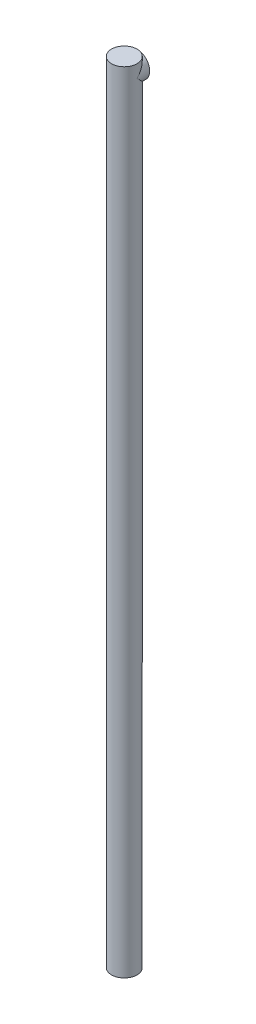
ISO-10303-21;
HEADER;
FILE_DESCRIPTION(('STEP AP214'),'2;1');
FILE_NAME('part.step','',(''),(''),'','','');
FILE_SCHEMA(('AUTOMOTIVE_DESIGN { 1 0 10303 214 1 1 1 1 }'));
ENDSEC;
DATA;
#1=APPLICATION_CONTEXT('core data for automotive mechanical design processes');
#2=APPLICATION_PROTOCOL_DEFINITION('international standard','automotive_design',2000,#1);
#3=PRODUCT_CONTEXT('',#1,'mechanical');
#4=PRODUCT('Part','Part','',(#3));
#5=PRODUCT_RELATED_PRODUCT_CATEGORY('part','',(#4));
#6=PRODUCT_DEFINITION_FORMATION('','',#4);
#7=PRODUCT_DEFINITION_CONTEXT('part definition',#1,'design');
#8=PRODUCT_DEFINITION('design','',#6,#7);
#9=PRODUCT_DEFINITION_SHAPE('','',#8);
#10=(LENGTH_UNIT() NAMED_UNIT(*) SI_UNIT(.MILLI.,.METRE.));
#11=(NAMED_UNIT(*) PLANE_ANGLE_UNIT() SI_UNIT($,.RADIAN.));
#12=(NAMED_UNIT(*) SI_UNIT($,.STERADIAN.) SOLID_ANGLE_UNIT());
#13=UNCERTAINTY_MEASURE_WITH_UNIT(LENGTH_MEASURE(1.E-05),#10,'distance_accuracy_value','');
#14=(GEOMETRIC_REPRESENTATION_CONTEXT(3) GLOBAL_UNCERTAINTY_ASSIGNED_CONTEXT((#13)) GLOBAL_UNIT_ASSIGNED_CONTEXT((#10,
#11,#12)) REPRESENTATION_CONTEXT('',''));
#15=CARTESIAN_POINT('',(0.,0.,0.));
#16=DIRECTION('',(0.,0.,1.));
#17=DIRECTION('',(1.,0.,0.));
#18=AXIS2_PLACEMENT_3D('',#15,#16,#17);
#19=CARTESIAN_POINT('',(0.,155.,0.));
#20=DIRECTION('',(0.,-1.,0.));
#21=DIRECTION('',(0.,0.,-1.));
#22=AXIS2_PLACEMENT_3D('',#19,#20,#21);
#23=CYLINDRICAL_SURFACE('',#22,2.5);
#24=CARTESIAN_POINT('',(0.,152.5,0.));
#25=DIRECTION('',(0.,-0.707106781186547,0.707106781186547));
#26=DIRECTION('',(0.,-0.707106781186547,-0.707106781186547));
#27=AXIS2_PLACEMENT_3D('',#24,#25,#26);
#28=ELLIPSE('',#27,3.53553390593274,2.5);
#29=CARTESIAN_POINT('',(0.,150.,-2.5));
#30=VERTEX_POINT('',#29);
#31=CARTESIAN_POINT('',(2.5,152.5,0.));
#32=VERTEX_POINT('',#31);
#33=EDGE_CURVE('E59',#30,#32,#28,.T.);
#34=ORIENTED_EDGE('',*,*,#33,.T.);
#35=CARTESIAN_POINT('',(0.,152.5,0.));
#36=DIRECTION('',(0.,-0.707106781186547,-0.707106781186547));
#37=DIRECTION('',(0.,-0.707106781186547,0.707106781186547));
#38=AXIS2_PLACEMENT_3D('',#35,#36,#37);
#39=ELLIPSE('',#38,3.53553390593274,2.5);
#40=CARTESIAN_POINT('',(0.,155.,-2.5));
#41=VERTEX_POINT('',#40);
#42=EDGE_CURVE('E65',#32,#41,#39,.F.);
#43=ORIENTED_EDGE('',*,*,#42,.T.);
#44=CARTESIAN_POINT('',(0.,155.,0.));
#45=DIRECTION('',(0.,1.,0.));
#46=DIRECTION('',(0.,0.,1.));
#47=AXIS2_PLACEMENT_3D('',#44,#45,#46);
#48=CIRCLE('',#47,2.5);
#49=EDGE_CURVE('E11',#41,#41,#48,.T.);
#50=ORIENTED_EDGE('',*,*,#49,.F.);
#51=CARTESIAN_POINT('',(-2.5,152.5,0.));
#52=VERTEX_POINT('',#51);
#53=EDGE_CURVE('E72',#41,#52,#39,.F.);
#54=ORIENTED_EDGE('',*,*,#53,.T.);
#55=EDGE_CURVE('E51',#52,#30,#28,.T.);
#56=ORIENTED_EDGE('',*,*,#55,.T.);
#57=EDGE_LOOP('',(#34,#43,#50,#54,#56));
#58=FACE_BOUND('',#57,.T.);
#59=CARTESIAN_POINT('',(0.,0.,0.));
#60=DIRECTION('',(0.,1.,0.));
#61=DIRECTION('',(0.,0.,1.));
#62=AXIS2_PLACEMENT_3D('',#59,#60,#61);
#63=CIRCLE('',#62,2.5);
#64=CARTESIAN_POINT('',(0.,0.,2.5));
#65=VERTEX_POINT('',#64);
#66=EDGE_CURVE('E40',#65,#65,#63,.T.);
#67=ORIENTED_EDGE('',*,*,#66,.T.);
#68=EDGE_LOOP('',(#67));
#69=FACE_BOUND('',#68,.T.);
#70=ADVANCED_FACE('F37',(#58,#69),#23,.T.);
#71=CARTESIAN_POINT('',(0.,155.,0.));
#72=DIRECTION('',(0.,1.,0.));
#73=DIRECTION('',(0.,0.,1.));
#74=AXIS2_PLACEMENT_3D('',#71,#72,#73);
#75=PLANE('',#74);
#76=ORIENTED_EDGE('',*,*,#49,.T.);
#77=EDGE_LOOP('',(#76));
#78=FACE_BOUND('',#77,.T.);
#79=ADVANCED_FACE('F87',(#78),#75,.T.);
#80=CARTESIAN_POINT('',(0.,0.,0.));
#81=DIRECTION('',(0.,1.,0.));
#82=DIRECTION('',(0.,0.,1.));
#83=AXIS2_PLACEMENT_3D('',#80,#81,#82);
#84=PLANE('',#83);
#85=ORIENTED_EDGE('',*,*,#66,.F.);
#86=EDGE_LOOP('',(#85));
#87=FACE_BOUND('',#86,.T.);
#88=ADVANCED_FACE('F91',(#87),#84,.F.);
#89=CARTESIAN_POINT('',(0.,152.5,-2.5));
#90=DIRECTION('',(0.,0.,1.));
#91=DIRECTION('',(1.,0.,0.));
#92=AXIS2_PLACEMENT_3D('',#89,#90,#91);
#93=CYLINDRICAL_SURFACE('',#92,2.5);
#94=ORIENTED_EDGE('',*,*,#42,.F.);
#95=ORIENTED_EDGE('',*,*,#33,.F.);
#96=CARTESIAN_POINT('',(0.,152.5,-2.5));
#97=DIRECTION('',(0.,0.,1.));
#98=DIRECTION('',(1.,0.,0.));
#99=AXIS2_PLACEMENT_3D('',#96,#97,#98);
#100=CIRCLE('',#99,2.5);
#101=EDGE_CURVE('E67',#30,#41,#100,.T.);
#102=ORIENTED_EDGE('',*,*,#101,.T.);
#103=EDGE_LOOP('',(#94,#95,#102));
#104=FACE_BOUND('',#103,.T.);
#105=ADVANCED_FACE('F66',(#104),#93,.T.);
#106=ORIENTED_EDGE('',*,*,#55,.F.);
#107=ORIENTED_EDGE('',*,*,#53,.F.);
#108=EDGE_CURVE('E76',#41,#30,#100,.T.);
#109=ORIENTED_EDGE('',*,*,#108,.T.);
#110=EDGE_LOOP('',(#106,#107,#109));
#111=FACE_BOUND('',#110,.T.);
#112=ADVANCED_FACE('F77',(#111),#93,.T.);
#113=CARTESIAN_POINT('',(0.,152.5,-2.5));
#114=DIRECTION('',(0.,0.,1.));
#115=DIRECTION('',(1.,0.,0.));
#116=AXIS2_PLACEMENT_3D('',#113,#114,#115);
#117=PLANE('',#116);
#118=ORIENTED_EDGE('',*,*,#108,.F.);
#119=ORIENTED_EDGE('',*,*,#101,.F.);
#120=EDGE_LOOP('',(#118,#119));
#121=FACE_BOUND('',#120,.T.);
#122=ADVANCED_FACE('F79',(#121),#117,.F.);
#123=CLOSED_SHELL('',(#70,#79,#88,#105,#112,#122));
#124=MANIFOLD_SOLID_BREP('B2',#123);
#125=ADVANCED_BREP_SHAPE_REPRESENTATION('',(#18,#124),#14);
#126=SHAPE_DEFINITION_REPRESENTATION(#9,#125);
ENDSEC;
END-ISO-10303-21;
